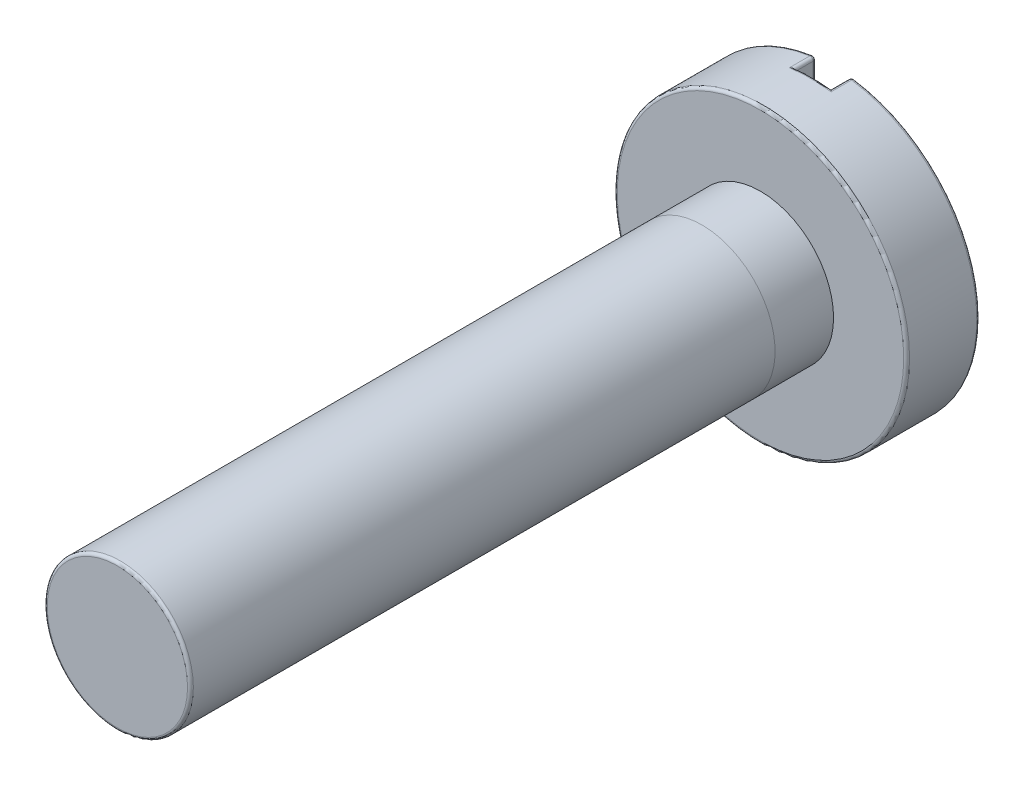
ISO-10303-21;
HEADER;
FILE_DESCRIPTION(('STEP AP214'),'2;1');
FILE_NAME('part.step','',(''),(''),'','','');
FILE_SCHEMA(('AUTOMOTIVE_DESIGN { 1 0 10303 214 1 1 1 1 }'));
ENDSEC;
DATA;
#1=APPLICATION_CONTEXT('core data for automotive mechanical design processes');
#2=APPLICATION_PROTOCOL_DEFINITION('international standard','automotive_design',2000,#1);
#3=PRODUCT_CONTEXT('',#1,'mechanical');
#4=PRODUCT('Part','Part','',(#3));
#5=PRODUCT_RELATED_PRODUCT_CATEGORY('part','',(#4));
#6=PRODUCT_DEFINITION_FORMATION('','',#4);
#7=PRODUCT_DEFINITION_CONTEXT('part definition',#1,'design');
#8=PRODUCT_DEFINITION('design','',#6,#7);
#9=PRODUCT_DEFINITION_SHAPE('','',#8);
#10=(LENGTH_UNIT() NAMED_UNIT(*) SI_UNIT(.MILLI.,.METRE.));
#11=(NAMED_UNIT(*) PLANE_ANGLE_UNIT() SI_UNIT($,.RADIAN.));
#12=(NAMED_UNIT(*) SI_UNIT($,.STERADIAN.) SOLID_ANGLE_UNIT());
#13=UNCERTAINTY_MEASURE_WITH_UNIT(LENGTH_MEASURE(1.E-05),#10,'distance_accuracy_value','');
#14=(GEOMETRIC_REPRESENTATION_CONTEXT(3) GLOBAL_UNCERTAINTY_ASSIGNED_CONTEXT((#13)) GLOBAL_UNIT_ASSIGNED_CONTEXT((#10,
#11,#12)) REPRESENTATION_CONTEXT('',''));
#15=CARTESIAN_POINT('',(0.,0.,0.));
#16=DIRECTION('',(0.,0.,1.));
#17=DIRECTION('',(1.,0.,0.));
#18=AXIS2_PLACEMENT_3D('',#15,#16,#17);
#19=CARTESIAN_POINT('',(0.,0.,11.));
#20=DIRECTION('',(0.,0.,-1.));
#21=DIRECTION('',(-1.,0.,0.));
#22=AXIS2_PLACEMENT_3D('',#19,#20,#21);
#23=CYLINDRICAL_SURFACE('',#22,1.25);
#24=CARTESIAN_POINT('',(0.,0.,10.95));
#25=DIRECTION('',(0.,0.,1.));
#26=DIRECTION('',(1.,0.,0.));
#27=AXIS2_PLACEMENT_3D('',#24,#25,#26);
#28=CIRCLE('',#27,1.25);
#29=CARTESIAN_POINT('',(1.25,0.,10.95));
#30=VERTEX_POINT('',#29);
#31=EDGE_CURVE('E175',#30,#30,#28,.F.);
#32=ORIENTED_EDGE('',*,*,#31,.T.);
#33=EDGE_LOOP('',(#32));
#34=FACE_BOUND('',#33,.T.);
#35=CARTESIAN_POINT('',(0.,0.,0.999999999999999));
#36=DIRECTION('',(0.,0.,-1.));
#37=DIRECTION('',(-1.,0.,0.));
#38=AXIS2_PLACEMENT_3D('',#35,#36,#37);
#39=CIRCLE('',#38,1.25);
#40=CARTESIAN_POINT('',(-1.25,0.,0.999999999999999));
#41=VERTEX_POINT('',#40);
#42=EDGE_CURVE('E11',#41,#41,#39,.T.);
#43=ORIENTED_EDGE('',*,*,#42,.F.);
#44=EDGE_LOOP('',(#43));
#45=FACE_BOUND('',#44,.T.);
#46=ADVANCED_FACE('F45',(#34,#45),#23,.T.);
#47=CARTESIAN_POINT('',(0.,0.,-1.25));
#48=DIRECTION('',(0.,0.,1.));
#49=DIRECTION('',(1.,0.,0.));
#50=AXIS2_PLACEMENT_3D('',#47,#48,#49);
#51=PLANE('',#50);
#52=DIRECTION('',(0.,-1.,0.));
#53=VECTOR('',#52,1.);
#54=CARTESIAN_POINT('',(-0.35,0.,-1.25));
#55=LINE('',#54,#53);
#56=CARTESIAN_POINT('',(-0.35,2.42487113059643,-1.25));
#57=VERTEX_POINT('',#56);
#58=CARTESIAN_POINT('',(-0.35,-2.42487113059643,-1.25));
#59=VERTEX_POINT('',#58);
#60=EDGE_CURVE('E212',#57,#59,#55,.T.);
#61=ORIENTED_EDGE('',*,*,#60,.T.);
#62=CARTESIAN_POINT('',(0.,0.,-1.25));
#63=DIRECTION('',(0.,0.,1.));
#64=DIRECTION('',(1.,0.,0.));
#65=AXIS2_PLACEMENT_3D('',#62,#63,#64);
#66=CIRCLE('',#65,2.45);
#67=EDGE_CURVE('E214',#59,#57,#66,.F.);
#68=ORIENTED_EDGE('',*,*,#67,.T.);
#69=EDGE_LOOP('',(#61,#68));
#70=FACE_BOUND('',#69,.T.);
#71=ADVANCED_FACE('F311',(#70),#51,.F.);
#72=ORIENTED_EDGE('',*,*,#42,.T.);
#73=EDGE_LOOP('',(#72));
#74=FACE_BOUND('',#73,.T.);
#75=CARTESIAN_POINT('',(0.,0.,0.));
#76=DIRECTION('',(0.,0.,1.));
#77=DIRECTION('',(1.,0.,0.));
#78=AXIS2_PLACEMENT_3D('',#75,#76,#77);
#79=CIRCLE('',#78,1.25);
#80=CARTESIAN_POINT('',(1.25,0.,0.));
#81=VERTEX_POINT('',#80);
#82=EDGE_CURVE('E337',#81,#81,#79,.T.);
#83=ORIENTED_EDGE('',*,*,#82,.T.);
#84=EDGE_LOOP('',(#83));
#85=FACE_BOUND('',#84,.T.);
#86=ADVANCED_FACE('F314',(#74,#85),#23,.T.);
#87=CARTESIAN_POINT('',(0.,0.,11.));
#88=DIRECTION('',(0.,0.,1.));
#89=DIRECTION('',(1.,0.,0.));
#90=AXIS2_PLACEMENT_3D('',#87,#88,#89);
#91=PLANE('',#90);
#92=CARTESIAN_POINT('',(0.,0.,11.));
#93=DIRECTION('',(0.,0.,1.));
#94=DIRECTION('',(1.,0.,0.));
#95=AXIS2_PLACEMENT_3D('',#92,#93,#94);
#96=CIRCLE('',#95,1.2);
#97=CARTESIAN_POINT('',(1.2,0.,11.));
#98=VERTEX_POINT('',#97);
#99=EDGE_CURVE('E339',#98,#98,#96,.T.);
#100=ORIENTED_EDGE('',*,*,#99,.T.);
#101=EDGE_LOOP('',(#100));
#102=FACE_BOUND('',#101,.T.);
#103=ADVANCED_FACE('F326',(#102),#91,.T.);
#104=CARTESIAN_POINT('',(0.,0.,-1.25));
#105=DIRECTION('',(0.,0.,1.));
#106=DIRECTION('',(1.,0.,0.));
#107=AXIS2_PLACEMENT_3D('',#104,#105,#106);
#108=CYLINDRICAL_SURFACE('',#107,2.5);
#109=CARTESIAN_POINT('',(0.,0.,-0.0499999999999999));
#110=DIRECTION('',(0.,0.,1.));
#111=DIRECTION('',(1.,0.,0.));
#112=AXIS2_PLACEMENT_3D('',#109,#110,#111);
#113=CIRCLE('',#112,2.5);
#114=CARTESIAN_POINT('',(2.5,0.,-0.0499999999999999));
#115=VERTEX_POINT('',#114);
#116=EDGE_CURVE('E189',#115,#115,#113,.F.);
#117=ORIENTED_EDGE('',*,*,#116,.T.);
#118=EDGE_LOOP('',(#117));
#119=FACE_BOUND('',#118,.T.);
#120=DIRECTION('',(0.,0.,1.));
#121=VECTOR('',#120,1.);
#122=CARTESIAN_POINT('',(0.357142857142857,-2.47435829652697,-1.25));
#123=LINE('',#122,#121);
#124=CARTESIAN_POINT('',(0.357142857142857,-2.47435829652697,-0.85));
#125=VERTEX_POINT('',#124);
#126=CARTESIAN_POINT('',(0.357142857142857,-2.47435829652697,-1.2));
#127=VERTEX_POINT('',#126);
#128=EDGE_CURVE('E185',#125,#127,#123,.F.);
#129=ORIENTED_EDGE('',*,*,#128,.T.);
#130=CARTESIAN_POINT('',(0.,0.,-1.2));
#131=DIRECTION('',(0.,0.,1.));
#132=DIRECTION('',(1.,0.,0.));
#133=AXIS2_PLACEMENT_3D('',#130,#131,#132);
#134=CIRCLE('',#133,2.5);
#135=CARTESIAN_POINT('',(0.357142857142857,2.47435829652697,-1.2));
#136=VERTEX_POINT('',#135);
#137=EDGE_CURVE('E187',#127,#136,#134,.T.);
#138=ORIENTED_EDGE('',*,*,#137,.T.);
#139=DIRECTION('',(0.,0.,1.));
#140=VECTOR('',#139,1.);
#141=CARTESIAN_POINT('',(0.357142857142857,2.47435829652697,-1.25));
#142=LINE('',#141,#140);
#143=CARTESIAN_POINT('',(0.357142857142858,2.47435829652697,-0.85));
#144=VERTEX_POINT('',#143);
#145=EDGE_CURVE('E183',#136,#144,#142,.T.);
#146=ORIENTED_EDGE('',*,*,#145,.T.);
#147=CARTESIAN_POINT('',(0.,0.,-0.85));
#148=DIRECTION('',(0.,0.,-1.));
#149=DIRECTION('',(-1.,0.,0.));
#150=AXIS2_PLACEMENT_3D('',#147,#148,#149);
#151=CIRCLE('',#150,2.5);
#152=CARTESIAN_POINT('',(-0.357142857142857,2.47435829652697,-0.85));
#153=VERTEX_POINT('',#152);
#154=EDGE_CURVE('E141',#144,#153,#151,.F.);
#155=ORIENTED_EDGE('',*,*,#154,.T.);
#156=DIRECTION('',(0.,0.,1.));
#157=VECTOR('',#156,1.);
#158=CARTESIAN_POINT('',(-0.357142857142857,2.47435829652697,-1.25));
#159=LINE('',#158,#157);
#160=CARTESIAN_POINT('',(-0.357142857142857,2.47435829652697,-1.2));
#161=VERTEX_POINT('',#160);
#162=EDGE_CURVE('E133',#153,#161,#159,.F.);
#163=ORIENTED_EDGE('',*,*,#162,.T.);
#164=CARTESIAN_POINT('',(0.,0.,-1.2));
#165=DIRECTION('',(0.,0.,1.));
#166=DIRECTION('',(1.,0.,0.));
#167=AXIS2_PLACEMENT_3D('',#164,#165,#166);
#168=CIRCLE('',#167,2.5);
#169=CARTESIAN_POINT('',(-0.357142857142857,-2.47435829652697,-1.2));
#170=VERTEX_POINT('',#169);
#171=EDGE_CURVE('E138',#161,#170,#168,.T.);
#172=ORIENTED_EDGE('',*,*,#171,.T.);
#173=DIRECTION('',(0.,0.,1.));
#174=VECTOR('',#173,1.);
#175=CARTESIAN_POINT('',(-0.357142857142857,-2.47435829652697,-1.25));
#176=LINE('',#175,#174);
#177=CARTESIAN_POINT('',(-0.357142857142857,-2.47435829652697,-0.85));
#178=VERTEX_POINT('',#177);
#179=EDGE_CURVE('E144',#170,#178,#176,.T.);
#180=ORIENTED_EDGE('',*,*,#179,.T.);
#181=CARTESIAN_POINT('',(0.,0.,-0.85));
#182=DIRECTION('',(0.,0.,-1.));
#183=DIRECTION('',(-1.,0.,0.));
#184=AXIS2_PLACEMENT_3D('',#181,#182,#183);
#185=CIRCLE('',#184,2.5);
#186=EDGE_CURVE('E181',#178,#125,#185,.F.);
#187=ORIENTED_EDGE('',*,*,#186,.T.);
#188=EDGE_LOOP('',(#129,#138,#146,#155,#163,#172,#180,#187));
#189=FACE_BOUND('',#188,.T.);
#190=ADVANCED_FACE('F135',(#119,#189),#108,.T.);
#191=CARTESIAN_POINT('',(0.,0.,-1.25));
#192=DIRECTION('',(0.,0.,1.));
#193=DIRECTION('',(1.,0.,0.));
#194=AXIS2_PLACEMENT_3D('',#191,#192,#193);
#195=CIRCLE('',#194,2.45);
#196=CARTESIAN_POINT('',(0.35,2.42487113059643,-1.25));
#197=VERTEX_POINT('',#196);
#198=CARTESIAN_POINT('',(0.35,-2.42487113059643,-1.25));
#199=VERTEX_POINT('',#198);
#200=EDGE_CURVE('E207',#197,#199,#195,.F.);
#201=ORIENTED_EDGE('',*,*,#200,.T.);
#202=DIRECTION('',(0.,1.,0.));
#203=VECTOR('',#202,1.);
#204=CARTESIAN_POINT('',(0.35,0.,-1.25));
#205=LINE('',#204,#203);
#206=EDGE_CURVE('E209',#199,#197,#205,.T.);
#207=ORIENTED_EDGE('',*,*,#206,.T.);
#208=EDGE_LOOP('',(#201,#207));
#209=FACE_BOUND('',#208,.T.);
#210=ADVANCED_FACE('F320',(#209),#51,.F.);
#211=CARTESIAN_POINT('',(0.,0.,0.));
#212=DIRECTION('',(0.,0.,1.));
#213=DIRECTION('',(1.,0.,0.));
#214=AXIS2_PLACEMENT_3D('',#211,#212,#213);
#215=PLANE('',#214);
#216=CARTESIAN_POINT('',(0.,0.,0.));
#217=DIRECTION('',(0.,0.,1.));
#218=DIRECTION('',(1.,0.,0.));
#219=AXIS2_PLACEMENT_3D('',#216,#217,#218);
#220=CIRCLE('',#219,2.45);
#221=CARTESIAN_POINT('',(2.45,0.,0.));
#222=VERTEX_POINT('',#221);
#223=EDGE_CURVE('E172',#222,#222,#220,.T.);
#224=ORIENTED_EDGE('',*,*,#223,.T.);
#225=EDGE_LOOP('',(#224));
#226=FACE_BOUND('',#225,.T.);
#227=ORIENTED_EDGE('',*,*,#82,.F.);
#228=EDGE_LOOP('',(#227));
#229=FACE_BOUND('',#228,.T.);
#230=ADVANCED_FACE('F370',(#226,#229),#215,.T.);
#231=CARTESIAN_POINT('',(-0.299999999999999,4.18375597630475,-0.9));
#232=DIRECTION('',(-1.,0.,0.));
#233=DIRECTION('',(0.,-1.,0.));
#234=AXIS2_PLACEMENT_3D('',#231,#232,#233);
#235=PLANE('',#234);
#236=DIRECTION('',(0.,1.,0.));
#237=VECTOR('',#236,1.);
#238=CARTESIAN_POINT('',(-0.299999999999999,4.18375597630475,-0.9));
#239=LINE('',#238,#237);
#240=CARTESIAN_POINT('',(-0.3,-2.42487113059643,-0.9));
#241=VERTEX_POINT('',#240);
#242=CARTESIAN_POINT('',(-0.3,2.42487113059643,-0.9));
#243=VERTEX_POINT('',#242);
#244=EDGE_CURVE('E345',#241,#243,#239,.T.);
#245=ORIENTED_EDGE('',*,*,#244,.F.);
#246=DIRECTION('',(0.,0.,-1.));
#247=VECTOR('',#246,1.);
#248=CARTESIAN_POINT('',(-0.3,-2.42487113059643,-1.25));
#249=LINE('',#248,#247);
#250=CARTESIAN_POINT('',(-0.3,-2.42487113059643,-1.2));
#251=VERTEX_POINT('',#250);
#252=EDGE_CURVE('E195',#241,#251,#249,.T.);
#253=ORIENTED_EDGE('',*,*,#252,.T.);
#254=DIRECTION('',(0.,-1.,0.));
#255=VECTOR('',#254,1.);
#256=CARTESIAN_POINT('',(-0.299999999999999,4.18375597630475,-1.2));
#257=LINE('',#256,#255);
#258=CARTESIAN_POINT('',(-0.3,2.42487113059643,-1.2));
#259=VERTEX_POINT('',#258);
#260=EDGE_CURVE('E192',#251,#259,#257,.F.);
#261=ORIENTED_EDGE('',*,*,#260,.T.);
#262=DIRECTION('',(0.,0.,-1.));
#263=VECTOR('',#262,1.);
#264=CARTESIAN_POINT('',(-0.3,2.42487113059643,-0.9));
#265=LINE('',#264,#263);
#266=EDGE_CURVE('E152',#259,#243,#265,.F.);
#267=ORIENTED_EDGE('',*,*,#266,.T.);
#268=EDGE_LOOP('',(#245,#253,#261,#267));
#269=FACE_BOUND('',#268,.T.);
#270=ADVANCED_FACE('F365',(#269),#235,.F.);
#271=CARTESIAN_POINT('',(0.3,4.18375597630475,-0.9));
#272=DIRECTION('',(1.,0.,0.));
#273=DIRECTION('',(0.,1.,0.));
#274=AXIS2_PLACEMENT_3D('',#271,#272,#273);
#275=PLANE('',#274);
#276=DIRECTION('',(0.,1.,0.));
#277=VECTOR('',#276,1.);
#278=CARTESIAN_POINT('',(0.3,4.18375597630475,-1.2));
#279=LINE('',#278,#277);
#280=CARTESIAN_POINT('',(0.3,2.42487113059643,-1.2));
#281=VERTEX_POINT('',#280);
#282=CARTESIAN_POINT('',(0.3,-2.42487113059643,-1.2));
#283=VERTEX_POINT('',#282);
#284=EDGE_CURVE('E201',#281,#283,#279,.F.);
#285=ORIENTED_EDGE('',*,*,#284,.T.);
#286=DIRECTION('',(0.,0.,-1.));
#287=VECTOR('',#286,1.);
#288=CARTESIAN_POINT('',(0.3,-2.42487113059643,-0.9));
#289=LINE('',#288,#287);
#290=CARTESIAN_POINT('',(0.3,-2.42487113059643,-0.9));
#291=VERTEX_POINT('',#290);
#292=EDGE_CURVE('E205',#283,#291,#289,.F.);
#293=ORIENTED_EDGE('',*,*,#292,.T.);
#294=DIRECTION('',(0.,-1.,0.));
#295=VECTOR('',#294,1.);
#296=CARTESIAN_POINT('',(0.3,4.18375597630475,-0.9));
#297=LINE('',#296,#295);
#298=CARTESIAN_POINT('',(0.3,2.42487113059643,-0.9));
#299=VERTEX_POINT('',#298);
#300=EDGE_CURVE('E340',#299,#291,#297,.T.);
#301=ORIENTED_EDGE('',*,*,#300,.F.);
#302=DIRECTION('',(0.,0.,-1.));
#303=VECTOR('',#302,1.);
#304=CARTESIAN_POINT('',(0.3,2.42487113059643,-1.25));
#305=LINE('',#304,#303);
#306=EDGE_CURVE('E203',#299,#281,#305,.T.);
#307=ORIENTED_EDGE('',*,*,#306,.T.);
#308=EDGE_LOOP('',(#285,#293,#301,#307));
#309=FACE_BOUND('',#308,.T.);
#310=ADVANCED_FACE('F360',(#309),#275,.F.);
#311=CARTESIAN_POINT('',(0.,0.,-0.9));
#312=DIRECTION('',(0.,0.,-1.));
#313=DIRECTION('',(-1.,0.,0.));
#314=AXIS2_PLACEMENT_3D('',#311,#312,#313);
#315=PLANE('',#314);
#316=ORIENTED_EDGE('',*,*,#300,.T.);
#317=CARTESIAN_POINT('',(0.35,-2.42487113059643,-0.9));
#318=DIRECTION('',(0.,0.,-1.));
#319=DIRECTION('',(-1.,0.,0.));
#320=AXIS2_PLACEMENT_3D('',#317,#318,#319);
#321=CIRCLE('',#320,0.05);
#322=CARTESIAN_POINT('',(0.300442524222203,-2.43150864477982,-0.9));
#323=VERTEX_POINT('',#322);
#324=EDGE_CURVE('E218',#291,#323,#321,.F.);
#325=ORIENTED_EDGE('',*,*,#324,.T.);
#326=CARTESIAN_POINT('',(0.,0.,-0.9));
#327=DIRECTION('',(0.,0.,-1.));
#328=DIRECTION('',(-1.,0.,0.));
#329=AXIS2_PLACEMENT_3D('',#326,#327,#328);
#330=CIRCLE('',#329,2.45);
#331=CARTESIAN_POINT('',(-0.300442524222203,-2.43150864477982,-0.9));
#332=VERTEX_POINT('',#331);
#333=EDGE_CURVE('E199',#323,#332,#330,.T.);
#334=ORIENTED_EDGE('',*,*,#333,.T.);
#335=CARTESIAN_POINT('',(-0.35,-2.42487113059643,-0.9));
#336=DIRECTION('',(0.,0.,-1.));
#337=DIRECTION('',(-1.,0.,0.));
#338=AXIS2_PLACEMENT_3D('',#335,#336,#337);
#339=CIRCLE('',#338,0.05);
#340=EDGE_CURVE('E216',#332,#241,#339,.F.);
#341=ORIENTED_EDGE('',*,*,#340,.T.);
#342=ORIENTED_EDGE('',*,*,#244,.T.);
#343=CARTESIAN_POINT('',(-0.35,2.42487113059643,-0.9));
#344=DIRECTION('',(0.,0.,-1.));
#345=DIRECTION('',(-1.,0.,0.));
#346=AXIS2_PLACEMENT_3D('',#343,#344,#345);
#347=CIRCLE('',#346,0.05);
#348=CARTESIAN_POINT('',(-0.300442524222203,2.43150864477982,-0.9));
#349=VERTEX_POINT('',#348);
#350=EDGE_CURVE('E221',#243,#349,#347,.F.);
#351=ORIENTED_EDGE('',*,*,#350,.T.);
#352=CARTESIAN_POINT('',(0.,0.,-0.9));
#353=DIRECTION('',(0.,0.,-1.));
#354=DIRECTION('',(-1.,0.,0.));
#355=AXIS2_PLACEMENT_3D('',#352,#353,#354);
#356=CIRCLE('',#355,2.45);
#357=CARTESIAN_POINT('',(0.300442524222203,2.43150864477982,-0.9));
#358=VERTEX_POINT('',#357);
#359=EDGE_CURVE('E61',#349,#358,#356,.T.);
#360=ORIENTED_EDGE('',*,*,#359,.T.);
#361=CARTESIAN_POINT('',(0.35,2.42487113059643,-0.9));
#362=DIRECTION('',(0.,0.,-1.));
#363=DIRECTION('',(-1.,0.,0.));
#364=AXIS2_PLACEMENT_3D('',#361,#362,#363);
#365=CIRCLE('',#364,0.05);
#366=EDGE_CURVE('E54',#358,#299,#365,.F.);
#367=ORIENTED_EDGE('',*,*,#366,.T.);
#368=EDGE_LOOP('',(#316,#325,#334,#341,#342,#351,#360,#367));
#369=FACE_BOUND('',#368,.T.);
#370=ADVANCED_FACE('F353',(#369),#315,.T.);
#371=CARTESIAN_POINT('',(0.,0.,10.95));
#372=DIRECTION('',(0.,0.,1.));
#373=DIRECTION('',(1.,0.,0.));
#374=AXIS2_PLACEMENT_3D('',#371,#372,#373);
#375=TOROIDAL_SURFACE('',#374,1.2,0.05);
#376=ORIENTED_EDGE('',*,*,#31,.F.);
#377=EDGE_LOOP('',(#376));
#378=FACE_BOUND('',#377,.T.);
#379=ORIENTED_EDGE('',*,*,#99,.F.);
#380=EDGE_LOOP('',(#379));
#381=FACE_BOUND('',#380,.T.);
#382=ADVANCED_FACE('F350',(#378,#381),#375,.T.);
#383=CARTESIAN_POINT('',(0.,0.,-0.0499999999999999));
#384=DIRECTION('',(0.,0.,1.));
#385=DIRECTION('',(1.,0.,0.));
#386=AXIS2_PLACEMENT_3D('',#383,#384,#385);
#387=TOROIDAL_SURFACE('',#386,2.45,0.05);
#388=ORIENTED_EDGE('',*,*,#116,.F.);
#389=EDGE_LOOP('',(#388));
#390=FACE_BOUND('',#389,.T.);
#391=ORIENTED_EDGE('',*,*,#223,.F.);
#392=EDGE_LOOP('',(#391));
#393=FACE_BOUND('',#392,.T.);
#394=ADVANCED_FACE('F301',(#390,#393),#387,.T.);
#395=CARTESIAN_POINT('',(0.35,2.42487113059643,-1.25));
#396=DIRECTION('',(0.,0.,1.));
#397=DIRECTION('',(1.,0.,0.));
#398=AXIS2_PLACEMENT_3D('',#395,#396,#397);
#399=CYLINDRICAL_SURFACE('',#398,0.05);
#400=CARTESIAN_POINT('',(0.35,2.42487113059643,-1.2));
#401=DIRECTION('',(0.,0.,-1.));
#402=DIRECTION('',(-1.,0.,0.));
#403=AXIS2_PLACEMENT_3D('',#400,#401,#402);
#404=CIRCLE('',#403,0.05);
#405=EDGE_CURVE('E296',#281,#136,#404,.T.);
#406=ORIENTED_EDGE('',*,*,#405,.F.);
#407=ORIENTED_EDGE('',*,*,#306,.F.);
#408=ORIENTED_EDGE('',*,*,#366,.F.);
#409=CARTESIAN_POINT('',(0.300442524222203,2.43150864477982,-0.9));
#410=CARTESIAN_POINT('',(0.300737460115032,2.4337391583632,-0.900003722786308));
#411=CARTESIAN_POINT('',(0.301189357405597,2.43594273392778,-0.899848409406808));
#412=CARTESIAN_POINT('',(0.302363071845994,2.44021672452454,-0.899253761503804));
#413=CARTESIAN_POINT('',(0.303082504758034,2.44228813185545,-0.898816911506534));
#414=CARTESIAN_POINT('',(0.304751429234414,2.44625382136388,-0.897693784392294));
#415=CARTESIAN_POINT('',(0.305700265459075,2.44814858716448,-0.897008215051631));
#416=CARTESIAN_POINT('',(0.307783492538972,2.45174285049612,-0.895429797249818));
#417=CARTESIAN_POINT('',(0.308918302793429,2.45344189153993,-0.89453647832874));
#418=CARTESIAN_POINT('',(0.311821792984343,2.4572801435548,-0.892185663182204));
#419=CARTESIAN_POINT('',(0.313660311918188,2.459316520653,-0.890646617476502));
#420=CARTESIAN_POINT('',(0.317523160483653,2.46298113747292,-0.887335037632831));
#421=CARTESIAN_POINT('',(0.319547836265721,2.46460859497026,-0.885562065744637));
#422=CARTESIAN_POINT('',(0.324501059094481,2.46802146160049,-0.881152524132882));
#423=CARTESIAN_POINT('',(0.327482429909653,2.46963481691332,-0.878442498370429));
#424=CARTESIAN_POINT('',(0.333548644696681,2.47220208521597,-0.872836536922113));
#425=CARTESIAN_POINT('',(0.33663359712912,2.4731552828483,-0.869940403267411));
#426=CARTESIAN_POINT('',(0.34247517182552,2.47438108643958,-0.864379966643362));
#427=CARTESIAN_POINT('',(0.34522924962939,2.47471874593213,-0.861726738315254));
#428=CARTESIAN_POINT('',(0.350711540888424,2.47494109560618,-0.856383963662668));
#429=CARTESIAN_POINT('',(0.353439794094476,2.47482666147234,-0.853694497594557));
#430=CARTESIAN_POINT('',(0.356472492387092,2.47445158033044,-0.850670012080672));
#431=CARTESIAN_POINT('',(0.356807939640554,2.47440663219586,-0.850334986006349));
#432=CARTESIAN_POINT('',(0.357142857142857,2.47435829652697,-0.85));
#433=B_SPLINE_CURVE_WITH_KNOTS('',3,(#409,#410,#411,#412,#413,#414,#415,#416,#417,#418,#419,
#420,#421,#422,#423,#424,#425,#426,#427,#428,#429,#430,#431,#432),.UNSPECIFIED.,.F.,.F.,(4,2,2,
2,2,2,2,2,2,2,2,4),(0.,0.00672980702502761,0.0134010227948132,0.0200534014281494,
0.0267209939979767,0.0361061015561922,0.045509027550098,0.0584594296217897,0.0714238430930104,
0.0829144010875782,0.0943827133197211,0.0958113219528248),.UNSPECIFIED.);
#434=EDGE_CURVE('E291',#144,#358,#433,.F.);
#435=ORIENTED_EDGE('',*,*,#434,.F.);
#436=ORIENTED_EDGE('',*,*,#145,.F.);
#437=EDGE_LOOP('',(#406,#407,#408,#435,#436));
#438=FACE_BOUND('',#437,.T.);
#439=ADVANCED_FACE('F298',(#438),#399,.T.);
#440=CARTESIAN_POINT('',(0.35,2.42487113059643,-1.2));
#441=DIRECTION('',(0.,0.,-1.));
#442=DIRECTION('',(-1.,0.,0.));
#443=AXIS2_PLACEMENT_3D('',#440,#441,#442);
#444=SPHERICAL_SURFACE('',#443,0.05);
#445=CARTESIAN_POINT('',(0.35,2.42487113059643,-1.2));
#446=DIRECTION('',(0.,1.,0.));
#447=DIRECTION('',(0.,0.,1.));
#448=AXIS2_PLACEMENT_3D('',#445,#446,#447);
#449=CIRCLE('',#448,0.05);
#450=EDGE_CURVE('E278',#281,#197,#449,.F.);
#451=ORIENTED_EDGE('',*,*,#450,.F.);
#452=ORIENTED_EDGE('',*,*,#405,.T.);
#453=CARTESIAN_POINT('',(0.35,2.42487113059643,-1.2));
#454=DIRECTION('',(-0.989743318610787,0.142857142857143,0.));
#455=DIRECTION('',(-0.142857142857143,-0.989743318610787,0.));
#456=AXIS2_PLACEMENT_3D('',#453,#454,#455);
#457=CIRCLE('',#456,0.05);
#458=EDGE_CURVE('E297',#197,#136,#457,.F.);
#459=ORIENTED_EDGE('',*,*,#458,.F.);
#460=EDGE_LOOP('',(#451,#452,#459));
#461=FACE_BOUND('',#460,.T.);
#462=ADVANCED_FACE('F47',(#461),#444,.T.);
#463=CARTESIAN_POINT('',(0.,0.,-0.85));
#464=DIRECTION('',(0.,0.,-1.));
#465=DIRECTION('',(-1.,0.,0.));
#466=AXIS2_PLACEMENT_3D('',#463,#464,#465);
#467=TOROIDAL_SURFACE('',#466,2.45,0.05);
#468=ORIENTED_EDGE('',*,*,#359,.F.);
#469=CARTESIAN_POINT('',(-0.300442524222203,2.43150864477982,-0.9));
#470=CARTESIAN_POINT('',(-0.300737460115031,2.4337391583632,-0.900003722786308));
#471=CARTESIAN_POINT('',(-0.301189357405596,2.43594273392778,-0.899848409406808));
#472=CARTESIAN_POINT('',(-0.302363071845994,2.44021672452454,-0.899253761503804));
#473=CARTESIAN_POINT('',(-0.303082504758033,2.44228813185545,-0.898816911506534));
#474=CARTESIAN_POINT('',(-0.304751429234413,2.44625382136388,-0.897693784392294));
#475=CARTESIAN_POINT('',(-0.305700265459075,2.44814858716448,-0.897008215051631));
#476=CARTESIAN_POINT('',(-0.307783492538972,2.45174285049612,-0.895429797249818));
#477=CARTESIAN_POINT('',(-0.308918302793428,2.45344189153993,-0.89453647832874));
#478=CARTESIAN_POINT('',(-0.311821792984342,2.4572801435548,-0.892185663182204));
#479=CARTESIAN_POINT('',(-0.313660311918187,2.459316520653,-0.890646617476502));
#480=CARTESIAN_POINT('',(-0.317523160483653,2.46298113747292,-0.887335037632831));
#481=CARTESIAN_POINT('',(-0.31954783626572,2.46460859497026,-0.885562065744637));
#482=CARTESIAN_POINT('',(-0.32450105909448,2.46802146160049,-0.881152524132882));
#483=CARTESIAN_POINT('',(-0.327482429909653,2.46963481691332,-0.87844249837043));
#484=CARTESIAN_POINT('',(-0.33354864469668,2.47220208521597,-0.872836536922113));
#485=CARTESIAN_POINT('',(-0.336633597129119,2.4731552828483,-0.869940403267411));
#486=CARTESIAN_POINT('',(-0.342475171825522,2.47438108643958,-0.864379966643365));
#487=CARTESIAN_POINT('',(-0.345229249629395,2.47471874593213,-0.86172673831526));
#488=CARTESIAN_POINT('',(-0.35071154088842,2.47494109560618,-0.856383963662664));
#489=CARTESIAN_POINT('',(-0.353439794094459,2.47482666147234,-0.85369449759454));
#490=CARTESIAN_POINT('',(-0.356472492387087,2.47445158033045,-0.850670012080668));
#491=CARTESIAN_POINT('',(-0.356807939640551,2.47440663219586,-0.850334986006346));
#492=CARTESIAN_POINT('',(-0.357142857142857,2.47435829652697,-0.85));
#493=B_SPLINE_CURVE_WITH_KNOTS('',3,(#469,#470,#471,#472,#473,#474,#475,#476,#477,#478,#479,
#480,#481,#482,#483,#484,#485,#486,#487,#488,#489,#490,#491,#492),.UNSPECIFIED.,.F.,.F.,(4,2,2,
2,2,2,2,2,2,2,2,4),(0.,0.0067298070250276,0.0134010227948132,0.0200534014281494,
0.0267209939979767,0.0361061015561921,0.0455090275500981,0.0584594296217897,0.0714238430930103,
0.0829144010875783,0.0943827133197214,0.0958113219528249),.UNSPECIFIED.);
#494=EDGE_CURVE('E270',#153,#349,#493,.F.);
#495=ORIENTED_EDGE('',*,*,#494,.F.);
#496=ORIENTED_EDGE('',*,*,#154,.F.);
#497=ORIENTED_EDGE('',*,*,#434,.T.);
#498=EDGE_LOOP('',(#468,#495,#496,#497));
#499=FACE_BOUND('',#498,.T.);
#500=ADVANCED_FACE('F282',(#499),#467,.T.);
#501=CARTESIAN_POINT('',(0.,0.,-1.2));
#502=DIRECTION('',(0.,0.,1.));
#503=DIRECTION('',(1.,0.,0.));
#504=AXIS2_PLACEMENT_3D('',#501,#502,#503);
#505=TOROIDAL_SURFACE('',#504,2.45,0.05);
#506=ORIENTED_EDGE('',*,*,#458,.T.);
#507=ORIENTED_EDGE('',*,*,#137,.F.);
#508=CARTESIAN_POINT('',(0.35,-2.42487113059643,-1.2));
#509=DIRECTION('',(-0.989743318610787,-0.142857142857142,0.));
#510=DIRECTION('',(0.142857142857142,-0.989743318610787,0.));
#511=AXIS2_PLACEMENT_3D('',#508,#509,#510);
#512=CIRCLE('',#511,0.05);
#513=EDGE_CURVE('E267',#199,#127,#512,.T.);
#514=ORIENTED_EDGE('',*,*,#513,.F.);
#515=ORIENTED_EDGE('',*,*,#200,.F.);
#516=EDGE_LOOP('',(#506,#507,#514,#515));
#517=FACE_BOUND('',#516,.T.);
#518=ADVANCED_FACE('F286',(#517),#505,.T.);
#519=CARTESIAN_POINT('',(0.35,0.,-1.2));
#520=DIRECTION('',(0.,1.,0.));
#521=DIRECTION('',(-1.,0.,0.));
#522=AXIS2_PLACEMENT_3D('',#519,#520,#521);
#523=CYLINDRICAL_SURFACE('',#522,0.05);
#524=ORIENTED_EDGE('',*,*,#450,.T.);
#525=ORIENTED_EDGE('',*,*,#206,.F.);
#526=CARTESIAN_POINT('',(0.35,-2.42487113059643,-1.2));
#527=DIRECTION('',(0.,-1.,0.));
#528=DIRECTION('',(0.,0.,-1.));
#529=AXIS2_PLACEMENT_3D('',#526,#527,#528);
#530=CIRCLE('',#529,0.05);
#531=EDGE_CURVE('E156',#283,#199,#530,.T.);
#532=ORIENTED_EDGE('',*,*,#531,.F.);
#533=ORIENTED_EDGE('',*,*,#284,.F.);
#534=EDGE_LOOP('',(#524,#525,#532,#533));
#535=FACE_BOUND('',#534,.T.);
#536=ADVANCED_FACE('F287',(#535),#523,.T.);
#537=CARTESIAN_POINT('',(-0.35,2.42487113059643,-1.25));
#538=DIRECTION('',(0.,0.,1.));
#539=DIRECTION('',(1.,0.,0.));
#540=AXIS2_PLACEMENT_3D('',#537,#538,#539);
#541=CYLINDRICAL_SURFACE('',#540,0.05);
#542=ORIENTED_EDGE('',*,*,#350,.F.);
#543=ORIENTED_EDGE('',*,*,#266,.F.);
#544=CARTESIAN_POINT('',(-0.35,2.42487113059643,-1.2));
#545=DIRECTION('',(0.,0.,-1.));
#546=DIRECTION('',(-1.,0.,0.));
#547=AXIS2_PLACEMENT_3D('',#544,#545,#546);
#548=CIRCLE('',#547,0.05);
#549=EDGE_CURVE('E148',#161,#259,#548,.T.);
#550=ORIENTED_EDGE('',*,*,#549,.F.);
#551=ORIENTED_EDGE('',*,*,#162,.F.);
#552=ORIENTED_EDGE('',*,*,#494,.T.);
#553=EDGE_LOOP('',(#542,#543,#550,#551,#552));
#554=FACE_BOUND('',#553,.T.);
#555=ADVANCED_FACE('F151',(#554),#541,.T.);
#556=CARTESIAN_POINT('',(0.35,-2.42487113059643,-1.2));
#557=DIRECTION('',(0.,0.,-1.));
#558=DIRECTION('',(-1.,0.,0.));
#559=AXIS2_PLACEMENT_3D('',#556,#557,#558);
#560=SPHERICAL_SURFACE('',#559,0.05);
#561=ORIENTED_EDGE('',*,*,#531,.T.);
#562=ORIENTED_EDGE('',*,*,#513,.T.);
#563=CARTESIAN_POINT('',(0.35,-2.42487113059643,-1.2));
#564=DIRECTION('',(0.,0.,-1.));
#565=DIRECTION('',(-1.,0.,0.));
#566=AXIS2_PLACEMENT_3D('',#563,#564,#565);
#567=CIRCLE('',#566,0.05);
#568=EDGE_CURVE('E157',#283,#127,#567,.F.);
#569=ORIENTED_EDGE('',*,*,#568,.F.);
#570=EDGE_LOOP('',(#561,#562,#569));
#571=FACE_BOUND('',#570,.T.);
#572=ADVANCED_FACE('F439',(#571),#560,.T.);
#573=CARTESIAN_POINT('',(-0.35,2.42487113059643,-1.2));
#574=DIRECTION('',(0.,0.,-1.));
#575=DIRECTION('',(-1.,0.,0.));
#576=AXIS2_PLACEMENT_3D('',#573,#574,#575);
#577=SPHERICAL_SURFACE('',#576,0.05);
#578=CARTESIAN_POINT('',(-0.35,2.42487113059643,-1.2));
#579=DIRECTION('',(0.989743318610787,0.142857142857144,0.));
#580=DIRECTION('',(-0.142857142857144,0.989743318610787,0.));
#581=AXIS2_PLACEMENT_3D('',#578,#579,#580);
#582=CIRCLE('',#581,0.05);
#583=EDGE_CURVE('E160',#161,#57,#582,.F.);
#584=ORIENTED_EDGE('',*,*,#583,.F.);
#585=ORIENTED_EDGE('',*,*,#549,.T.);
#586=CARTESIAN_POINT('',(-0.35,2.42487113059643,-1.2));
#587=DIRECTION('',(0.,1.,0.));
#588=DIRECTION('',(0.,0.,1.));
#589=AXIS2_PLACEMENT_3D('',#586,#587,#588);
#590=CIRCLE('',#589,0.05);
#591=EDGE_CURVE('E162',#57,#259,#590,.F.);
#592=ORIENTED_EDGE('',*,*,#591,.F.);
#593=EDGE_LOOP('',(#584,#585,#592));
#594=FACE_BOUND('',#593,.T.);
#595=ADVANCED_FACE('F161',(#594),#577,.T.);
#596=CARTESIAN_POINT('',(0.35,-2.42487113059643,-1.25));
#597=DIRECTION('',(0.,0.,1.));
#598=DIRECTION('',(1.,0.,0.));
#599=AXIS2_PLACEMENT_3D('',#596,#597,#598);
#600=CYLINDRICAL_SURFACE('',#599,0.05);
#601=ORIENTED_EDGE('',*,*,#568,.T.);
#602=ORIENTED_EDGE('',*,*,#128,.F.);
#603=CARTESIAN_POINT('',(0.300442524222203,-2.43150864477982,-0.9));
#604=CARTESIAN_POINT('',(0.300737460115031,-2.4337391583632,-0.900003722786308));
#605=CARTESIAN_POINT('',(0.301189357405596,-2.43594273392778,-0.899848409406808));
#606=CARTESIAN_POINT('',(0.302363071845994,-2.44021672452454,-0.899253761503804));
#607=CARTESIAN_POINT('',(0.303082504758033,-2.44228813185545,-0.898816911506534));
#608=CARTESIAN_POINT('',(0.304751429234413,-2.44625382136388,-0.897693784392294));
#609=CARTESIAN_POINT('',(0.305700265459074,-2.44814858716448,-0.897008215051631));
#610=CARTESIAN_POINT('',(0.307783492538971,-2.45174285049612,-0.895429797249818));
#611=CARTESIAN_POINT('',(0.308918302793428,-2.45344189153993,-0.89453647832874));
#612=CARTESIAN_POINT('',(0.311821792984342,-2.4572801435548,-0.892185663182204));
#613=CARTESIAN_POINT('',(0.313660311918187,-2.459316520653,-0.890646617476502));
#614=CARTESIAN_POINT('',(0.317523160483653,-2.46298113747292,-0.887335037632831));
#615=CARTESIAN_POINT('',(0.31954783626572,-2.46460859497026,-0.885562065744637));
#616=CARTESIAN_POINT('',(0.32450105909448,-2.46802146160049,-0.881152524132882));
#617=CARTESIAN_POINT('',(0.327482429909653,-2.46963481691332,-0.878442498370429));
#618=CARTESIAN_POINT('',(0.33354864469668,-2.47220208521597,-0.872836536922113));
#619=CARTESIAN_POINT('',(0.336633597129119,-2.4731552828483,-0.869940403267411));
#620=CARTESIAN_POINT('',(0.342475171825521,-2.47438108643958,-0.864379966643365));
#621=CARTESIAN_POINT('',(0.345229249629393,-2.47471874593213,-0.861726738315258));
#622=CARTESIAN_POINT('',(0.35071154088842,-2.47494109560618,-0.856383963662664));
#623=CARTESIAN_POINT('',(0.353439794094463,-2.47482666147234,-0.853694497594544));
#624=CARTESIAN_POINT('',(0.356472492387088,-2.47445158033044,-0.850670012080669));
#625=CARTESIAN_POINT('',(0.356807939640551,-2.47440663219586,-0.850334986006347));
#626=CARTESIAN_POINT('',(0.357142857142857,-2.47435829652697,-0.85));
#627=B_SPLINE_CURVE_WITH_KNOTS('',3,(#603,#604,#605,#606,#607,#608,#609,#610,#611,#612,#613,
#614,#615,#616,#617,#618,#619,#620,#621,#622,#623,#624,#625,#626),.UNSPECIFIED.,.F.,.F.,(4,2,2,
2,2,2,2,2,2,2,2,4),(0.,0.0067298070250276,0.0134010227948132,0.0200534014281494,
0.0267209939979767,0.0361061015561921,0.045509027550098,0.0584594296217898,0.0714238430930103,
0.0829144010875783,0.0943827133197214,0.0958113219528249),.UNSPECIFIED.);
#628=EDGE_CURVE('E166',#323,#125,#627,.T.);
#629=ORIENTED_EDGE('',*,*,#628,.F.);
#630=ORIENTED_EDGE('',*,*,#324,.F.);
#631=ORIENTED_EDGE('',*,*,#292,.F.);
#632=EDGE_LOOP('',(#601,#602,#629,#630,#631));
#633=FACE_BOUND('',#632,.T.);
#634=ADVANCED_FACE('F247',(#633),#600,.T.);
#635=CARTESIAN_POINT('',(-0.35,0.,-1.2));
#636=DIRECTION('',(0.,-1.,0.));
#637=DIRECTION('',(1.,0.,0.));
#638=AXIS2_PLACEMENT_3D('',#635,#636,#637);
#639=CYLINDRICAL_SURFACE('',#638,0.05);
#640=ORIENTED_EDGE('',*,*,#591,.T.);
#641=ORIENTED_EDGE('',*,*,#260,.F.);
#642=CARTESIAN_POINT('',(-0.35,-2.42487113059643,-1.2));
#643=DIRECTION('',(0.,-1.,0.));
#644=DIRECTION('',(0.,0.,-1.));
#645=AXIS2_PLACEMENT_3D('',#642,#643,#644);
#646=CIRCLE('',#645,0.05);
#647=EDGE_CURVE('E260',#59,#251,#646,.T.);
#648=ORIENTED_EDGE('',*,*,#647,.F.);
#649=ORIENTED_EDGE('',*,*,#60,.F.);
#650=EDGE_LOOP('',(#640,#641,#648,#649));
#651=FACE_BOUND('',#650,.T.);
#652=ADVANCED_FACE('F251',(#651),#639,.T.);
#653=CARTESIAN_POINT('',(0.,0.,-1.2));
#654=DIRECTION('',(0.,0.,1.));
#655=DIRECTION('',(1.,0.,0.));
#656=AXIS2_PLACEMENT_3D('',#653,#654,#655);
#657=TOROIDAL_SURFACE('',#656,2.45,0.05);
#658=ORIENTED_EDGE('',*,*,#583,.T.);
#659=ORIENTED_EDGE('',*,*,#67,.F.);
#660=CARTESIAN_POINT('',(-0.35,-2.42487113059643,-1.2));
#661=DIRECTION('',(0.989743318610787,-0.142857142857143,0.));
#662=DIRECTION('',(0.142857142857143,0.989743318610787,0.));
#663=AXIS2_PLACEMENT_3D('',#660,#661,#662);
#664=CIRCLE('',#663,0.05);
#665=EDGE_CURVE('E170',#170,#59,#664,.T.);
#666=ORIENTED_EDGE('',*,*,#665,.F.);
#667=ORIENTED_EDGE('',*,*,#171,.F.);
#668=EDGE_LOOP('',(#658,#659,#666,#667));
#669=FACE_BOUND('',#668,.T.);
#670=ADVANCED_FACE('F168',(#669),#657,.T.);
#671=CARTESIAN_POINT('',(0.,0.,-0.85));
#672=DIRECTION('',(0.,0.,-1.));
#673=DIRECTION('',(-1.,0.,0.));
#674=AXIS2_PLACEMENT_3D('',#671,#672,#673);
#675=TOROIDAL_SURFACE('',#674,2.45,0.05);
#676=ORIENTED_EDGE('',*,*,#628,.T.);
#677=ORIENTED_EDGE('',*,*,#186,.F.);
#678=CARTESIAN_POINT('',(-0.300442524222203,-2.43150864477982,-0.9));
#679=CARTESIAN_POINT('',(-0.300737460115032,-2.4337391583632,-0.900003722786308));
#680=CARTESIAN_POINT('',(-0.301189357405597,-2.43594273392778,-0.899848409406808));
#681=CARTESIAN_POINT('',(-0.302363071845994,-2.44021672452454,-0.899253761503804));
#682=CARTESIAN_POINT('',(-0.303082504758034,-2.44228813185545,-0.898816911506534));
#683=CARTESIAN_POINT('',(-0.304751429234414,-2.44625382136388,-0.897693784392294));
#684=CARTESIAN_POINT('',(-0.305700265459075,-2.44814858716448,-0.897008215051631));
#685=CARTESIAN_POINT('',(-0.307783492538972,-2.45174285049612,-0.895429797249818));
#686=CARTESIAN_POINT('',(-0.308918302793429,-2.45344189153993,-0.89453647832874));
#687=CARTESIAN_POINT('',(-0.311821792984343,-2.4572801435548,-0.892185663182204));
#688=CARTESIAN_POINT('',(-0.313660311918188,-2.459316520653,-0.890646617476502));
#689=CARTESIAN_POINT('',(-0.317523160483653,-2.46298113747292,-0.887335037632831));
#690=CARTESIAN_POINT('',(-0.319547836265721,-2.46460859497026,-0.885562065744637));
#691=CARTESIAN_POINT('',(-0.324501059094481,-2.46802146160049,-0.881152524132882));
#692=CARTESIAN_POINT('',(-0.327482429909653,-2.46963481691332,-0.878442498370429));
#693=CARTESIAN_POINT('',(-0.333548644696681,-2.47220208521597,-0.872836536922113));
#694=CARTESIAN_POINT('',(-0.33663359712912,-2.4731552828483,-0.869940403267411));
#695=CARTESIAN_POINT('',(-0.34247517182552,-2.47438108643958,-0.864379966643362));
#696=CARTESIAN_POINT('',(-0.34522924962939,-2.47471874593213,-0.861726738315254));
#697=CARTESIAN_POINT('',(-0.350711540888424,-2.47494109560618,-0.856383963662668));
#698=CARTESIAN_POINT('',(-0.353439794094476,-2.47482666147234,-0.853694497594557));
#699=CARTESIAN_POINT('',(-0.356472492387092,-2.47445158033044,-0.850670012080672));
#700=CARTESIAN_POINT('',(-0.356807939640554,-2.47440663219586,-0.850334986006349));
#701=CARTESIAN_POINT('',(-0.357142857142857,-2.47435829652697,-0.85));
#702=B_SPLINE_CURVE_WITH_KNOTS('',3,(#678,#679,#680,#681,#682,#683,#684,#685,#686,#687,#688,
#689,#690,#691,#692,#693,#694,#695,#696,#697,#698,#699,#700,#701),.UNSPECIFIED.,.F.,.F.,(4,2,2,
2,2,2,2,2,2,2,2,4),(0.,0.00672980702502761,0.0134010227948132,0.0200534014281494,
0.0267209939979767,0.0361061015561922,0.045509027550098,0.0584594296217897,0.0714238430930104,
0.0829144010875782,0.0943827133197211,0.0958113219528248),.UNSPECIFIED.);
#703=EDGE_CURVE('E226',#332,#178,#702,.T.);
#704=ORIENTED_EDGE('',*,*,#703,.F.);
#705=ORIENTED_EDGE('',*,*,#333,.F.);
#706=EDGE_LOOP('',(#676,#677,#704,#705));
#707=FACE_BOUND('',#706,.T.);
#708=ADVANCED_FACE('F235',(#707),#675,.T.);
#709=CARTESIAN_POINT('',(-0.35,-2.42487113059643,-1.2));
#710=DIRECTION('',(0.,0.,-1.));
#711=DIRECTION('',(-1.,0.,0.));
#712=AXIS2_PLACEMENT_3D('',#709,#710,#711);
#713=SPHERICAL_SURFACE('',#712,0.05);
#714=ORIENTED_EDGE('',*,*,#665,.T.);
#715=ORIENTED_EDGE('',*,*,#647,.T.);
#716=CARTESIAN_POINT('',(-0.35,-2.42487113059643,-1.2));
#717=DIRECTION('',(0.,0.,-1.));
#718=DIRECTION('',(-1.,0.,0.));
#719=AXIS2_PLACEMENT_3D('',#716,#717,#718);
#720=CIRCLE('',#719,0.05);
#721=EDGE_CURVE('E224',#170,#251,#720,.F.);
#722=ORIENTED_EDGE('',*,*,#721,.F.);
#723=EDGE_LOOP('',(#714,#715,#722));
#724=FACE_BOUND('',#723,.T.);
#725=ADVANCED_FACE('F242',(#724),#713,.T.);
#726=CARTESIAN_POINT('',(-0.35,-2.42487113059643,-1.25));
#727=DIRECTION('',(0.,0.,1.));
#728=DIRECTION('',(1.,0.,0.));
#729=AXIS2_PLACEMENT_3D('',#726,#727,#728);
#730=CYLINDRICAL_SURFACE('',#729,0.05);
#731=ORIENTED_EDGE('',*,*,#703,.T.);
#732=ORIENTED_EDGE('',*,*,#179,.F.);
#733=ORIENTED_EDGE('',*,*,#721,.T.);
#734=ORIENTED_EDGE('',*,*,#252,.F.);
#735=ORIENTED_EDGE('',*,*,#340,.F.);
#736=EDGE_LOOP('',(#731,#732,#733,#734,#735));
#737=FACE_BOUND('',#736,.T.);
#738=ADVANCED_FACE('F238',(#737),#730,.T.);
#739=CLOSED_SHELL('',(#46,#71,#86,#103,#190,#210,#230,#270,#310,#370,#382,#394,#439,#462,#500,
#518,#536,#555,#572,#595,#634,#652,#670,#708,#725,#738));
#740=MANIFOLD_SOLID_BREP('B2',#739);
#741=ADVANCED_BREP_SHAPE_REPRESENTATION('',(#18,#740),#14);
#742=SHAPE_DEFINITION_REPRESENTATION(#9,#741);
ENDSEC;
END-ISO-10303-21;
